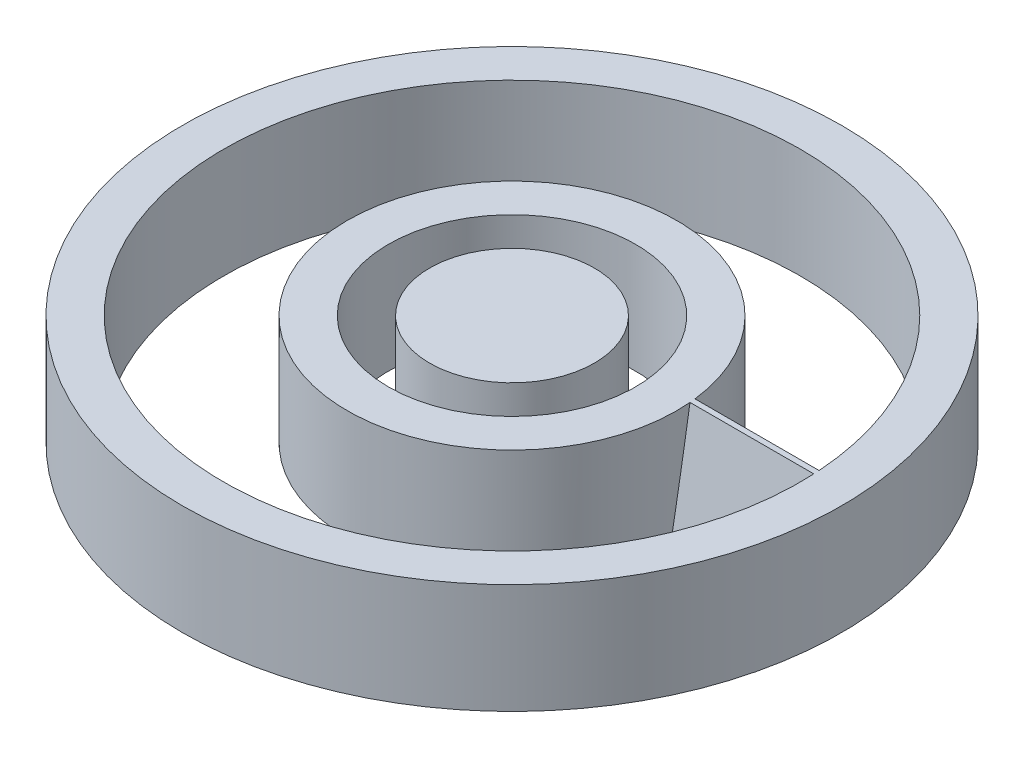
ISO-10303-21;
HEADER;
FILE_DESCRIPTION(('STEP AP214'),'2;1');
FILE_NAME('part.step','',(''),(''),'','','');
FILE_SCHEMA(('AUTOMOTIVE_DESIGN { 1 0 10303 214 1 1 1 1 }'));
ENDSEC;
DATA;
#1=APPLICATION_CONTEXT('core data for automotive mechanical design processes');
#2=APPLICATION_PROTOCOL_DEFINITION('international standard','automotive_design',2000,#1);
#3=PRODUCT_CONTEXT('',#1,'mechanical');
#4=PRODUCT('Part','Part','',(#3));
#5=PRODUCT_RELATED_PRODUCT_CATEGORY('part','',(#4));
#6=PRODUCT_DEFINITION_FORMATION('','',#4);
#7=PRODUCT_DEFINITION_CONTEXT('part definition',#1,'design');
#8=PRODUCT_DEFINITION('design','',#6,#7);
#9=PRODUCT_DEFINITION_SHAPE('','',#8);
#10=(LENGTH_UNIT() NAMED_UNIT(*) SI_UNIT(.MILLI.,.METRE.));
#11=(NAMED_UNIT(*) PLANE_ANGLE_UNIT() SI_UNIT($,.RADIAN.));
#12=(NAMED_UNIT(*) SI_UNIT($,.STERADIAN.) SOLID_ANGLE_UNIT());
#13=UNCERTAINTY_MEASURE_WITH_UNIT(LENGTH_MEASURE(1.E-05),#10,'distance_accuracy_value','');
#14=(GEOMETRIC_REPRESENTATION_CONTEXT(3) GLOBAL_UNCERTAINTY_ASSIGNED_CONTEXT((#13)) GLOBAL_UNIT_ASSIGNED_CONTEXT((#10,
#11,#12)) REPRESENTATION_CONTEXT('',''));
#15=CARTESIAN_POINT('',(0.,0.,0.));
#16=DIRECTION('',(0.,0.,1.));
#17=DIRECTION('',(1.,0.,0.));
#18=AXIS2_PLACEMENT_3D('',#15,#16,#17);
#19=CARTESIAN_POINT('',(0.,10.,0.));
#20=DIRECTION('',(0.,1.,0.));
#21=DIRECTION('',(0.,0.,1.));
#22=AXIS2_PLACEMENT_3D('',#19,#20,#21);
#23=PLANE('',#22);
#24=CARTESIAN_POINT('',(0.,10.,0.));
#25=DIRECTION('',(0.,1.,0.));
#26=DIRECTION('',(0.,0.,1.));
#27=AXIS2_PLACEMENT_3D('',#24,#25,#26);
#28=CIRCLE('',#27,30.);
#29=CARTESIAN_POINT('',(0.,10.,30.));
#30=VERTEX_POINT('',#29);
#31=EDGE_CURVE('E131',#30,#30,#28,.T.);
#32=ORIENTED_EDGE('',*,*,#31,.T.);
#33=EDGE_LOOP('',(#32));
#34=FACE_BOUND('',#33,.T.);
#35=DIRECTION('',(-1.,0.,0.));
#36=VECTOR('',#35,1.);
#37=CARTESIAN_POINT('',(500000.,10.,-1.76326980708462));
#38=LINE('',#37,#36);
#39=CARTESIAN_POINT('',(26.1907117044845,10.,-1.76326980708462));
#40=VERTEX_POINT('',#39);
#41=CARTESIAN_POINT('',(14.8960021344919,10.,-1.76326980708462));
#42=VERTEX_POINT('',#41);
#43=EDGE_CURVE('E123',#40,#42,#38,.T.);
#44=ORIENTED_EDGE('',*,*,#43,.T.);
#45=CARTESIAN_POINT('',(0.,10.,0.));
#46=DIRECTION('',(0.,1.,0.));
#47=DIRECTION('',(0.,0.,1.));
#48=AXIS2_PLACEMENT_3D('',#45,#46,#47);
#49=CIRCLE('',#48,15.);
#50=CARTESIAN_POINT('',(14.947360230905,10.,-1.25555650114175));
#51=VERTEX_POINT('',#50);
#52=EDGE_CURVE('E111',#42,#51,#49,.T.);
#53=ORIENTED_EDGE('',*,*,#52,.T.);
#54=DIRECTION('',(-1.,0.,0.));
#55=VECTOR('',#54,1.);
#56=CARTESIAN_POINT('',(500000.,10.,-1.25555650114175));
#57=LINE('',#56,#55);
#58=CARTESIAN_POINT('',(26.2199557184886,10.,-1.25555650114175));
#59=VERTEX_POINT('',#58);
#60=EDGE_CURVE('E108',#59,#51,#57,.T.);
#61=ORIENTED_EDGE('',*,*,#60,.F.);
#62=CARTESIAN_POINT('',(0.,10.,0.));
#63=DIRECTION('',(0.,1.,0.));
#64=DIRECTION('',(0.,0.,1.));
#65=AXIS2_PLACEMENT_3D('',#62,#63,#64);
#66=CIRCLE('',#65,26.25);
#67=EDGE_CURVE('E141',#40,#59,#66,.T.);
#68=ORIENTED_EDGE('',*,*,#67,.F.);
#69=EDGE_LOOP('',(#44,#53,#61,#68));
#70=FACE_BOUND('',#69,.T.);
#71=CARTESIAN_POINT('',(0.,10.,0.));
#72=DIRECTION('',(0.,1.,0.));
#73=DIRECTION('',(0.,0.,1.));
#74=AXIS2_PLACEMENT_3D('',#71,#72,#73);
#75=CIRCLE('',#74,11.25);
#76=CARTESIAN_POINT('',(0.,10.,11.25));
#77=VERTEX_POINT('',#76);
#78=EDGE_CURVE('E112',#77,#77,#75,.T.);
#79=ORIENTED_EDGE('',*,*,#78,.F.);
#80=EDGE_LOOP('',(#79));
#81=FACE_BOUND('',#80,.T.);
#82=ADVANCED_FACE('F61',(#34,#70,#81),#23,.T.);
#83=CARTESIAN_POINT('',(0.,0.,0.));
#84=DIRECTION('',(0.,1.,0.));
#85=DIRECTION('',(0.,0.,1.));
#86=AXIS2_PLACEMENT_3D('',#83,#84,#85);
#87=PLANE('',#86);
#88=CARTESIAN_POINT('',(0.,0.,0.));
#89=DIRECTION('',(0.,1.,0.));
#90=DIRECTION('',(0.,0.,1.));
#91=AXIS2_PLACEMENT_3D('',#88,#89,#90);
#92=CIRCLE('',#91,30.);
#93=CARTESIAN_POINT('',(0.,0.,30.));
#94=VERTEX_POINT('',#93);
#95=EDGE_CURVE('E134',#94,#94,#92,.T.);
#96=ORIENTED_EDGE('',*,*,#95,.F.);
#97=EDGE_LOOP('',(#96));
#98=FACE_BOUND('',#97,.T.);
#99=DIRECTION('',(-1.,0.,0.));
#100=VECTOR('',#99,1.);
#101=CARTESIAN_POINT('',(500000.,0.,0.507713305942872));
#102=LINE('',#101,#100);
#103=CARTESIAN_POINT('',(26.2450895827442,0.,0.507713305942872));
#104=VERTEX_POINT('',#103);
#105=CARTESIAN_POINT('',(14.991405110895,0.,0.507713305942872));
#106=VERTEX_POINT('',#105);
#107=EDGE_CURVE('E117',#104,#106,#102,.T.);
#108=ORIENTED_EDGE('',*,*,#107,.T.);
#109=CARTESIAN_POINT('',(0.,0.,0.));
#110=DIRECTION('',(0.,1.,0.));
#111=DIRECTION('',(0.,0.,1.));
#112=AXIS2_PLACEMENT_3D('',#109,#110,#111);
#113=CIRCLE('',#112,15.);
#114=CARTESIAN_POINT('',(15.0000000001569,0.,0.));
#115=VERTEX_POINT('',#114);
#116=EDGE_CURVE('E13',#115,#106,#113,.T.);
#117=ORIENTED_EDGE('',*,*,#116,.F.);
#118=DIRECTION('',(-1.,0.,0.));
#119=VECTOR('',#118,1.);
#120=CARTESIAN_POINT('',(500000.,0.,0.));
#121=LINE('',#120,#119);
#122=CARTESIAN_POINT('',(26.25,0.,0.));
#123=VERTEX_POINT('',#122);
#124=EDGE_CURVE('E98',#123,#115,#121,.T.);
#125=ORIENTED_EDGE('',*,*,#124,.F.);
#126=CARTESIAN_POINT('',(0.,0.,0.));
#127=DIRECTION('',(0.,1.,0.));
#128=DIRECTION('',(0.,0.,1.));
#129=AXIS2_PLACEMENT_3D('',#126,#127,#128);
#130=CIRCLE('',#129,26.25);
#131=EDGE_CURVE('E118',#123,#104,#130,.T.);
#132=ORIENTED_EDGE('',*,*,#131,.T.);
#133=EDGE_LOOP('',(#108,#117,#125,#132));
#134=FACE_BOUND('',#133,.T.);
#135=CARTESIAN_POINT('',(0.,0.,0.));
#136=DIRECTION('',(0.,1.,0.));
#137=DIRECTION('',(0.,0.,1.));
#138=AXIS2_PLACEMENT_3D('',#135,#136,#137);
#139=CIRCLE('',#138,11.25);
#140=CARTESIAN_POINT('',(0.,0.,11.25));
#141=VERTEX_POINT('',#140);
#142=EDGE_CURVE('E64',#141,#141,#139,.T.);
#143=ORIENTED_EDGE('',*,*,#142,.T.);
#144=EDGE_LOOP('',(#143));
#145=FACE_BOUND('',#144,.T.);
#146=ADVANCED_FACE('F115',(#98,#134,#145),#87,.F.);
#147=CARTESIAN_POINT('',(500000.,0.,0.));
#148=DIRECTION('',(0.,0.173648177666927,0.984807753012208));
#149=DIRECTION('',(0.,-0.984807753012209,0.173648177666927));
#150=AXIS2_PLACEMENT_3D('',#147,#148,#149);
#151=PLANE('',#150);
#152=CARTESIAN_POINT('',(0.,0.,0.));
#153=DIRECTION('',(0.,0.173648177666927,0.984807753012208));
#154=DIRECTION('',(0.,-0.984807753012209,0.173648177666927));
#155=AXIS2_PLACEMENT_3D('',#152,#153,#154);
#156=ELLIPSE('',#155,86.381557247156,15.);
#157=EDGE_CURVE('E70',#42,#115,#156,.F.);
#158=ORIENTED_EDGE('',*,*,#157,.F.);
#159=ORIENTED_EDGE('',*,*,#43,.F.);
#160=CARTESIAN_POINT('',(0.,0.,0.));
#161=DIRECTION('',(0.,0.173648177666927,0.984807753012208));
#162=DIRECTION('',(0.,-0.984807753012209,0.173648177666927));
#163=AXIS2_PLACEMENT_3D('',#160,#161,#162);
#164=ELLIPSE('',#163,151.167725182523,26.25);
#165=EDGE_CURVE('E103',#40,#123,#164,.F.);
#166=ORIENTED_EDGE('',*,*,#165,.T.);
#167=ORIENTED_EDGE('',*,*,#124,.T.);
#168=EDGE_LOOP('',(#158,#159,#166,#167));
#169=FACE_BOUND('',#168,.T.);
#170=ADVANCED_FACE('F100',(#169),#151,.F.);
#171=CARTESIAN_POINT('',(500000.,0.,0.507713305942872));
#172=DIRECTION('',(0.,0.173648177666927,0.984807753012208));
#173=DIRECTION('',(0.,-0.984807753012209,0.173648177666927));
#174=AXIS2_PLACEMENT_3D('',#171,#172,#173);
#175=PLANE('',#174);
#176=ORIENTED_EDGE('',*,*,#60,.T.);
#177=CARTESIAN_POINT('',(0.,2.87938524157187,0.));
#178=DIRECTION('',(0.,0.173648177666927,0.984807753012208));
#179=DIRECTION('',(0.,-0.984807753012209,0.173648177666927));
#180=AXIS2_PLACEMENT_3D('',#177,#178,#179);
#181=ELLIPSE('',#180,86.381557247156,15.);
#182=EDGE_CURVE('E76',#51,#106,#181,.F.);
#183=ORIENTED_EDGE('',*,*,#182,.T.);
#184=ORIENTED_EDGE('',*,*,#107,.F.);
#185=CARTESIAN_POINT('',(0.,2.87938524157187,0.));
#186=DIRECTION('',(0.,0.173648177666927,0.984807753012208));
#187=DIRECTION('',(0.,-0.984807753012209,0.173648177666927));
#188=AXIS2_PLACEMENT_3D('',#185,#186,#187);
#189=ELLIPSE('',#188,151.167725182523,26.25);
#190=EDGE_CURVE('E127',#59,#104,#189,.F.);
#191=ORIENTED_EDGE('',*,*,#190,.F.);
#192=EDGE_LOOP('',(#176,#183,#184,#191));
#193=FACE_BOUND('',#192,.T.);
#194=ADVANCED_FACE('F148',(#193),#175,.T.);
#195=CARTESIAN_POINT('',(0.,10.,0.));
#196=DIRECTION('',(0.,-1.,0.));
#197=DIRECTION('',(0.,0.,-1.));
#198=AXIS2_PLACEMENT_3D('',#195,#196,#197);
#199=CYLINDRICAL_SURFACE('',#198,26.25);
#200=ORIENTED_EDGE('',*,*,#131,.F.);
#201=ORIENTED_EDGE('',*,*,#165,.F.);
#202=ORIENTED_EDGE('',*,*,#67,.T.);
#203=ORIENTED_EDGE('',*,*,#190,.T.);
#204=EDGE_LOOP('',(#200,#201,#202,#203));
#205=FACE_BOUND('',#204,.T.);
#206=ADVANCED_FACE('F152',(#205),#199,.F.);
#207=CARTESIAN_POINT('',(0.,10.,0.));
#208=DIRECTION('',(0.,-1.,0.));
#209=DIRECTION('',(0.,0.,-1.));
#210=AXIS2_PLACEMENT_3D('',#207,#208,#209);
#211=CYLINDRICAL_SURFACE('',#210,30.);
#212=ORIENTED_EDGE('',*,*,#31,.F.);
#213=EDGE_LOOP('',(#212));
#214=FACE_BOUND('',#213,.T.);
#215=ORIENTED_EDGE('',*,*,#95,.T.);
#216=EDGE_LOOP('',(#215));
#217=FACE_BOUND('',#216,.T.);
#218=ADVANCED_FACE('F154',(#214,#217),#211,.T.);
#219=CARTESIAN_POINT('',(0.,10.,0.));
#220=DIRECTION('',(0.,-1.,0.));
#221=DIRECTION('',(0.,0.,-1.));
#222=AXIS2_PLACEMENT_3D('',#219,#220,#221);
#223=CYLINDRICAL_SURFACE('',#222,11.25);
#224=ORIENTED_EDGE('',*,*,#142,.F.);
#225=EDGE_LOOP('',(#224));
#226=FACE_BOUND('',#225,.T.);
#227=ORIENTED_EDGE('',*,*,#78,.T.);
#228=EDGE_LOOP('',(#227));
#229=FACE_BOUND('',#228,.T.);
#230=ADVANCED_FACE('F160',(#226,#229),#223,.F.);
#231=CARTESIAN_POINT('',(0.,10.,0.));
#232=DIRECTION('',(0.,-1.,0.));
#233=DIRECTION('',(0.,0.,-1.));
#234=AXIS2_PLACEMENT_3D('',#231,#232,#233);
#235=CYLINDRICAL_SURFACE('',#234,15.);
#236=ORIENTED_EDGE('',*,*,#52,.F.);
#237=ORIENTED_EDGE('',*,*,#157,.T.);
#238=ORIENTED_EDGE('',*,*,#116,.T.);
#239=ORIENTED_EDGE('',*,*,#182,.F.);
#240=EDGE_LOOP('',(#236,#237,#238,#239));
#241=FACE_BOUND('',#240,.T.);
#242=ADVANCED_FACE('F110',(#241),#235,.T.);
#243=CLOSED_SHELL('',(#82,#146,#170,#194,#206,#218,#230,#242));
#244=MANIFOLD_SOLID_BREP('B2',#243);
#245=CARTESIAN_POINT('',(0.,0.,0.));
#246=DIRECTION('',(0.,1.,0.));
#247=DIRECTION('',(0.,0.,1.));
#248=AXIS2_PLACEMENT_3D('',#245,#246,#247);
#249=PLANE('',#248);
#250=CARTESIAN_POINT('',(0.,0.,0.));
#251=DIRECTION('',(0.,1.,0.));
#252=DIRECTION('',(0.,0.,1.));
#253=AXIS2_PLACEMENT_3D('',#250,#251,#252);
#254=CIRCLE('',#253,7.5);
#255=CARTESIAN_POINT('',(0.,0.,7.5));
#256=VERTEX_POINT('',#255);
#257=EDGE_CURVE('E251',#256,#256,#254,.T.);
#258=ORIENTED_EDGE('',*,*,#257,.F.);
#259=EDGE_LOOP('',(#258));
#260=FACE_BOUND('',#259,.T.);
#261=ADVANCED_FACE('F248',(#260),#249,.F.);
#262=CARTESIAN_POINT('',(0.,10.,0.));
#263=DIRECTION('',(0.,1.,0.));
#264=DIRECTION('',(0.,0.,1.));
#265=AXIS2_PLACEMENT_3D('',#262,#263,#264);
#266=PLANE('',#265);
#267=CARTESIAN_POINT('',(0.,10.,0.));
#268=DIRECTION('',(0.,1.,0.));
#269=DIRECTION('',(0.,0.,1.));
#270=AXIS2_PLACEMENT_3D('',#267,#268,#269);
#271=CIRCLE('',#270,7.5);
#272=CARTESIAN_POINT('',(0.,10.,7.5));
#273=VERTEX_POINT('',#272);
#274=EDGE_CURVE('E60',#273,#273,#271,.T.);
#275=ORIENTED_EDGE('',*,*,#274,.T.);
#276=EDGE_LOOP('',(#275));
#277=FACE_BOUND('',#276,.T.);
#278=ADVANCED_FACE('F264',(#277),#266,.T.);
#279=CARTESIAN_POINT('',(0.,10.,0.));
#280=DIRECTION('',(0.,-1.,0.));
#281=DIRECTION('',(0.,0.,-1.));
#282=AXIS2_PLACEMENT_3D('',#279,#280,#281);
#283=CYLINDRICAL_SURFACE('',#282,7.5);
#284=ORIENTED_EDGE('',*,*,#257,.T.);
#285=EDGE_LOOP('',(#284));
#286=FACE_BOUND('',#285,.T.);
#287=ORIENTED_EDGE('',*,*,#274,.F.);
#288=EDGE_LOOP('',(#287));
#289=FACE_BOUND('',#288,.T.);
#290=ADVANCED_FACE('F260',(#286,#289),#283,.T.);
#291=CLOSED_SHELL('',(#261,#278,#290));
#292=MANIFOLD_SOLID_BREP('B7',#291);
#293=ADVANCED_BREP_SHAPE_REPRESENTATION('',(#18,#244,#292),#14);
#294=SHAPE_DEFINITION_REPRESENTATION(#9,#293);
ENDSEC;
END-ISO-10303-21;
